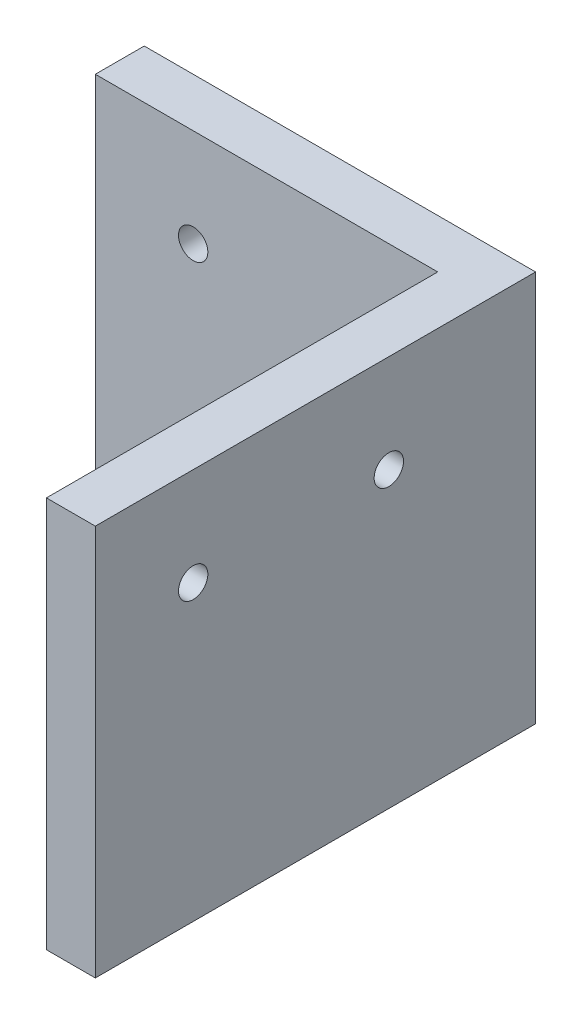
ISO-10303-21;
HEADER;
FILE_DESCRIPTION(('STEP AP214'),'2;1');
FILE_NAME('part.step','',(''),(''),'','','');
FILE_SCHEMA(('AUTOMOTIVE_DESIGN { 1 0 10303 214 1 1 1 1 }'));
ENDSEC;
DATA;
#1=APPLICATION_CONTEXT('core data for automotive mechanical design processes');
#2=APPLICATION_PROTOCOL_DEFINITION('international standard','automotive_design',2000,#1);
#3=PRODUCT_CONTEXT('',#1,'mechanical');
#4=PRODUCT('Part','Part','',(#3));
#5=PRODUCT_RELATED_PRODUCT_CATEGORY('part','',(#4));
#6=PRODUCT_DEFINITION_FORMATION('','',#4);
#7=PRODUCT_DEFINITION_CONTEXT('part definition',#1,'design');
#8=PRODUCT_DEFINITION('design','',#6,#7);
#9=PRODUCT_DEFINITION_SHAPE('','',#8);
#10=(LENGTH_UNIT() NAMED_UNIT(*) SI_UNIT(.MILLI.,.METRE.));
#11=(NAMED_UNIT(*) PLANE_ANGLE_UNIT() SI_UNIT($,.RADIAN.));
#12=(NAMED_UNIT(*) SI_UNIT($,.STERADIAN.) SOLID_ANGLE_UNIT());
#13=UNCERTAINTY_MEASURE_WITH_UNIT(LENGTH_MEASURE(1.E-05),#10,'distance_accuracy_value','');
#14=(GEOMETRIC_REPRESENTATION_CONTEXT(3) GLOBAL_UNCERTAINTY_ASSIGNED_CONTEXT((#13)) GLOBAL_UNIT_ASSIGNED_CONTEXT((#10,
#11,#12)) REPRESENTATION_CONTEXT('',''));
#15=CARTESIAN_POINT('',(0.,0.,0.));
#16=DIRECTION('',(0.,0.,1.));
#17=DIRECTION('',(1.,0.,0.));
#18=AXIS2_PLACEMENT_3D('',#15,#16,#17);
#19=CARTESIAN_POINT('',(0.,85.,18.));
#20=DIRECTION('',(-1.,0.,0.));
#21=DIRECTION('',(0.,0.,1.));
#22=AXIS2_PLACEMENT_3D('',#19,#20,#21);
#23=CYLINDRICAL_SURFACE('',#22,1.5);
#24=CARTESIAN_POINT('',(0.,85.,18.));
#25=DIRECTION('',(-1.,0.,0.));
#26=DIRECTION('',(0.,0.,1.));
#27=AXIS2_PLACEMENT_3D('',#24,#25,#26);
#28=CIRCLE('',#27,1.5);
#29=CARTESIAN_POINT('',(0.,85.,19.5));
#30=VERTEX_POINT('',#29);
#31=EDGE_CURVE('E120',#30,#30,#28,.T.);
#32=ORIENTED_EDGE('',*,*,#31,.F.);
#33=EDGE_LOOP('',(#32));
#34=FACE_BOUND('',#33,.T.);
#35=CARTESIAN_POINT('',(-3.5,85.,18.));
#36=DIRECTION('',(-1.,0.,0.));
#37=DIRECTION('',(0.,0.,1.));
#38=AXIS2_PLACEMENT_3D('',#35,#36,#37);
#39=CIRCLE('',#38,1.5);
#40=CARTESIAN_POINT('',(-3.5,85.,19.5));
#41=VERTEX_POINT('',#40);
#42=EDGE_CURVE('E49',#41,#41,#39,.F.);
#43=ORIENTED_EDGE('',*,*,#42,.F.);
#44=EDGE_LOOP('',(#43));
#45=FACE_BOUND('',#44,.T.);
#46=ADVANCED_FACE('F45',(#34,#45),#23,.F.);
#47=CARTESIAN_POINT('',(0.,85.,38.));
#48=DIRECTION('',(-1.,0.,0.));
#49=DIRECTION('',(0.,0.,1.));
#50=AXIS2_PLACEMENT_3D('',#47,#48,#49);
#51=CYLINDRICAL_SURFACE('',#50,1.5);
#52=CARTESIAN_POINT('',(0.,85.,38.));
#53=DIRECTION('',(-1.,0.,0.));
#54=DIRECTION('',(0.,0.,1.));
#55=AXIS2_PLACEMENT_3D('',#52,#53,#54);
#56=CIRCLE('',#55,1.5);
#57=CARTESIAN_POINT('',(0.,85.,39.5));
#58=VERTEX_POINT('',#57);
#59=EDGE_CURVE('E141',#58,#58,#56,.T.);
#60=ORIENTED_EDGE('',*,*,#59,.F.);
#61=EDGE_LOOP('',(#60));
#62=FACE_BOUND('',#61,.T.);
#63=CARTESIAN_POINT('',(-3.5,85.,38.));
#64=DIRECTION('',(-1.,0.,0.));
#65=DIRECTION('',(0.,0.,1.));
#66=AXIS2_PLACEMENT_3D('',#63,#64,#65);
#67=CIRCLE('',#66,1.5);
#68=CARTESIAN_POINT('',(-3.5,85.,39.5));
#69=VERTEX_POINT('',#68);
#70=EDGE_CURVE('E135',#69,#69,#67,.F.);
#71=ORIENTED_EDGE('',*,*,#70,.F.);
#72=EDGE_LOOP('',(#71));
#73=FACE_BOUND('',#72,.T.);
#74=ADVANCED_FACE('F220',(#62,#73),#51,.F.);
#75=CARTESIAN_POINT('',(-10.,85.,597.1));
#76=DIRECTION('',(0.,0.,-1.));
#77=DIRECTION('',(0.,1.,0.));
#78=AXIS2_PLACEMENT_3D('',#75,#76,#77);
#79=CYLINDRICAL_SURFACE('',#78,1.5);
#80=CARTESIAN_POINT('',(-10.,85.,3.));
#81=DIRECTION('',(0.,0.,-1.));
#82=DIRECTION('',(0.,1.,0.));
#83=AXIS2_PLACEMENT_3D('',#80,#81,#82);
#84=CIRCLE('',#83,1.5);
#85=CARTESIAN_POINT('',(-10.,86.5,3.));
#86=VERTEX_POINT('',#85);
#87=EDGE_CURVE('E174',#86,#86,#84,.T.);
#88=ORIENTED_EDGE('',*,*,#87,.T.);
#89=EDGE_LOOP('',(#88));
#90=FACE_BOUND('',#89,.T.);
#91=CARTESIAN_POINT('',(-10.,85.,8.00000000000001));
#92=DIRECTION('',(0.,0.,-1.));
#93=DIRECTION('',(0.,1.,0.));
#94=AXIS2_PLACEMENT_3D('',#91,#92,#93);
#95=CIRCLE('',#94,1.5);
#96=CARTESIAN_POINT('',(-10.,86.5,8.00000000000001));
#97=VERTEX_POINT('',#96);
#98=EDGE_CURVE('E182',#97,#97,#95,.T.);
#99=ORIENTED_EDGE('',*,*,#98,.F.);
#100=EDGE_LOOP('',(#99));
#101=FACE_BOUND('',#100,.T.);
#102=ADVANCED_FACE('F227',(#90,#101),#79,.F.);
#103=CARTESIAN_POINT('',(-30.,85.,597.1));
#104=DIRECTION('',(0.,0.,-1.));
#105=DIRECTION('',(0.,1.,0.));
#106=AXIS2_PLACEMENT_3D('',#103,#104,#105);
#107=CYLINDRICAL_SURFACE('',#106,1.5);
#108=CARTESIAN_POINT('',(-30.,85.,3.));
#109=DIRECTION('',(0.,0.,-1.));
#110=DIRECTION('',(0.,1.,0.));
#111=AXIS2_PLACEMENT_3D('',#108,#109,#110);
#112=CIRCLE('',#111,1.5);
#113=CARTESIAN_POINT('',(-30.,86.5,3.));
#114=VERTEX_POINT('',#113);
#115=EDGE_CURVE('E171',#114,#114,#112,.T.);
#116=ORIENTED_EDGE('',*,*,#115,.T.);
#117=EDGE_LOOP('',(#116));
#118=FACE_BOUND('',#117,.T.);
#119=CARTESIAN_POINT('',(-30.,85.,8.00000000000001));
#120=DIRECTION('',(0.,0.,-1.));
#121=DIRECTION('',(0.,1.,0.));
#122=AXIS2_PLACEMENT_3D('',#119,#120,#121);
#123=CIRCLE('',#122,1.5);
#124=CARTESIAN_POINT('',(-30.,86.5,8.00000000000001));
#125=VERTEX_POINT('',#124);
#126=EDGE_CURVE('E185',#125,#125,#123,.T.);
#127=ORIENTED_EDGE('',*,*,#126,.F.);
#128=EDGE_LOOP('',(#127));
#129=FACE_BOUND('',#128,.T.);
#130=ADVANCED_FACE('F240',(#118,#129),#107,.F.);
#131=CARTESIAN_POINT('',(-30.,65.,597.1));
#132=DIRECTION('',(0.,0.,-1.));
#133=DIRECTION('',(0.,1.,0.));
#134=AXIS2_PLACEMENT_3D('',#131,#132,#133);
#135=CYLINDRICAL_SURFACE('',#134,1.50000000000001);
#136=CARTESIAN_POINT('',(-30.,65.,3.));
#137=DIRECTION('',(0.,0.,-1.));
#138=DIRECTION('',(0.,1.,0.));
#139=AXIS2_PLACEMENT_3D('',#136,#137,#138);
#140=CIRCLE('',#139,1.50000000000001);
#141=CARTESIAN_POINT('',(-30.,66.5,3.));
#142=VERTEX_POINT('',#141);
#143=EDGE_CURVE('E175',#142,#142,#140,.T.);
#144=ORIENTED_EDGE('',*,*,#143,.T.);
#145=EDGE_LOOP('',(#144));
#146=FACE_BOUND('',#145,.T.);
#147=CARTESIAN_POINT('',(-30.,65.,8.00000000000001));
#148=DIRECTION('',(0.,0.,-1.));
#149=DIRECTION('',(0.,1.,0.));
#150=AXIS2_PLACEMENT_3D('',#147,#148,#149);
#151=CIRCLE('',#150,1.50000000000001);
#152=CARTESIAN_POINT('',(-30.,66.5,8.00000000000001));
#153=VERTEX_POINT('',#152);
#154=EDGE_CURVE('E188',#153,#153,#151,.T.);
#155=ORIENTED_EDGE('',*,*,#154,.F.);
#156=EDGE_LOOP('',(#155));
#157=FACE_BOUND('',#156,.T.);
#158=ADVANCED_FACE('F243',(#146,#157),#135,.F.);
#159=CARTESIAN_POINT('',(-10.,65.,597.1));
#160=DIRECTION('',(0.,0.,-1.));
#161=DIRECTION('',(0.,1.,0.));
#162=AXIS2_PLACEMENT_3D('',#159,#160,#161);
#163=CYLINDRICAL_SURFACE('',#162,1.5);
#164=CARTESIAN_POINT('',(-10.,65.,3.));
#165=DIRECTION('',(0.,0.,-1.));
#166=DIRECTION('',(0.,1.,0.));
#167=AXIS2_PLACEMENT_3D('',#164,#165,#166);
#168=CIRCLE('',#167,1.5);
#169=CARTESIAN_POINT('',(-10.,66.5,3.));
#170=VERTEX_POINT('',#169);
#171=EDGE_CURVE('E170',#170,#170,#168,.T.);
#172=ORIENTED_EDGE('',*,*,#171,.T.);
#173=EDGE_LOOP('',(#172));
#174=FACE_BOUND('',#173,.T.);
#175=CARTESIAN_POINT('',(-10.,65.,8.00000000000001));
#176=DIRECTION('',(0.,0.,-1.));
#177=DIRECTION('',(0.,1.,0.));
#178=AXIS2_PLACEMENT_3D('',#175,#176,#177);
#179=CIRCLE('',#178,1.5);
#180=CARTESIAN_POINT('',(-10.,66.5,8.00000000000001));
#181=VERTEX_POINT('',#180);
#182=EDGE_CURVE('E111',#181,#181,#179,.T.);
#183=ORIENTED_EDGE('',*,*,#182,.F.);
#184=EDGE_LOOP('',(#183));
#185=FACE_BOUND('',#184,.T.);
#186=ADVANCED_FACE('F247',(#174,#185),#163,.F.);
#187=CARTESIAN_POINT('',(-40.,0.,0.));
#188=DIRECTION('',(-1.,0.,0.));
#189=DIRECTION('',(0.,0.,1.));
#190=AXIS2_PLACEMENT_3D('',#187,#188,#189);
#191=PLANE('',#190);
#192=DIRECTION('',(0.,-1.,0.));
#193=VECTOR('',#192,1.);
#194=CARTESIAN_POINT('',(-40.,95.,3.));
#195=LINE('',#194,#193);
#196=CARTESIAN_POINT('',(-40.,95.,3.));
#197=VERTEX_POINT('',#196);
#198=CARTESIAN_POINT('',(-40.,55.,3.));
#199=VERTEX_POINT('',#198);
#200=EDGE_CURVE('E123',#197,#199,#195,.T.);
#201=ORIENTED_EDGE('',*,*,#200,.T.);
#202=DIRECTION('',(0.,0.,1.));
#203=VECTOR('',#202,1.);
#204=CARTESIAN_POINT('',(-40.,55.,3.));
#205=LINE('',#204,#203);
#206=CARTESIAN_POINT('',(-40.,55.,8.00000000000001));
#207=VERTEX_POINT('',#206);
#208=EDGE_CURVE('E194',#199,#207,#205,.T.);
#209=ORIENTED_EDGE('',*,*,#208,.T.);
#210=DIRECTION('',(0.,1.,0.));
#211=VECTOR('',#210,1.);
#212=CARTESIAN_POINT('',(-40.,95.,8.));
#213=LINE('',#212,#211);
#214=CARTESIAN_POINT('',(-40.,95.,8.));
#215=VERTEX_POINT('',#214);
#216=EDGE_CURVE('E129',#207,#215,#213,.T.);
#217=ORIENTED_EDGE('',*,*,#216,.T.);
#218=DIRECTION('',(0.,0.,-1.));
#219=VECTOR('',#218,1.);
#220=CARTESIAN_POINT('',(-40.,95.,3.));
#221=LINE('',#220,#219);
#222=EDGE_CURVE('E69',#215,#197,#221,.T.);
#223=ORIENTED_EDGE('',*,*,#222,.T.);
#224=EDGE_LOOP('',(#201,#209,#217,#223));
#225=FACE_BOUND('',#224,.T.);
#226=ADVANCED_FACE('F198',(#225),#191,.T.);
#227=CARTESIAN_POINT('',(-40.,95.,8.));
#228=DIRECTION('',(0.,0.,-1.));
#229=DIRECTION('',(0.,1.,0.));
#230=AXIS2_PLACEMENT_3D('',#227,#228,#229);
#231=PLANE('',#230);
#232=ORIENTED_EDGE('',*,*,#182,.T.);
#233=EDGE_LOOP('',(#232));
#234=FACE_BOUND('',#233,.T.);
#235=ORIENTED_EDGE('',*,*,#154,.T.);
#236=EDGE_LOOP('',(#235));
#237=FACE_BOUND('',#236,.T.);
#238=ORIENTED_EDGE('',*,*,#126,.T.);
#239=EDGE_LOOP('',(#238));
#240=FACE_BOUND('',#239,.T.);
#241=ORIENTED_EDGE('',*,*,#98,.T.);
#242=EDGE_LOOP('',(#241));
#243=FACE_BOUND('',#242,.T.);
#244=DIRECTION('',(1.,0.,0.));
#245=VECTOR('',#244,1.);
#246=CARTESIAN_POINT('',(-40.,55.,8.00000000000001));
#247=LINE('',#246,#245);
#248=CARTESIAN_POINT('',(-5.,55.,8.00000000000001));
#249=VERTEX_POINT('',#248);
#250=EDGE_CURVE('E127',#207,#249,#247,.T.);
#251=ORIENTED_EDGE('',*,*,#250,.T.);
#252=DIRECTION('',(0.,1.,0.));
#253=VECTOR('',#252,1.);
#254=CARTESIAN_POINT('',(-5.,95.,8.));
#255=LINE('',#254,#253);
#256=CARTESIAN_POINT('',(-5.,95.,8.));
#257=VERTEX_POINT('',#256);
#258=EDGE_CURVE('E11',#249,#257,#255,.T.);
#259=ORIENTED_EDGE('',*,*,#258,.T.);
#260=DIRECTION('',(1.,0.,0.));
#261=VECTOR('',#260,1.);
#262=CARTESIAN_POINT('',(-40.,95.,8.));
#263=LINE('',#262,#261);
#264=EDGE_CURVE('E124',#215,#257,#263,.T.);
#265=ORIENTED_EDGE('',*,*,#264,.F.);
#266=ORIENTED_EDGE('',*,*,#216,.F.);
#267=EDGE_LOOP('',(#251,#259,#265,#266));
#268=FACE_BOUND('',#267,.T.);
#269=ADVANCED_FACE('F201',(#234,#237,#240,#243,#268),#231,.F.);
#270=CARTESIAN_POINT('',(-5.,95.,48.));
#271=DIRECTION('',(0.,0.,-1.));
#272=DIRECTION('',(0.,1.,0.));
#273=AXIS2_PLACEMENT_3D('',#270,#271,#272);
#274=PLANE('',#273);
#275=DIRECTION('',(0.,1.,0.));
#276=VECTOR('',#275,1.);
#277=CARTESIAN_POINT('',(0.,95.,48.));
#278=LINE('',#277,#276);
#279=CARTESIAN_POINT('',(0.,55.,48.));
#280=VERTEX_POINT('',#279);
#281=CARTESIAN_POINT('',(0.,95.,48.));
#282=VERTEX_POINT('',#281);
#283=EDGE_CURVE('E119',#280,#282,#278,.T.);
#284=ORIENTED_EDGE('',*,*,#283,.T.);
#285=DIRECTION('',(1.,0.,0.));
#286=VECTOR('',#285,1.);
#287=CARTESIAN_POINT('',(-5.,95.,48.));
#288=LINE('',#287,#286);
#289=CARTESIAN_POINT('',(-5.,95.,48.));
#290=VERTEX_POINT('',#289);
#291=EDGE_CURVE('E117',#290,#282,#288,.T.);
#292=ORIENTED_EDGE('',*,*,#291,.F.);
#293=DIRECTION('',(0.,1.,0.));
#294=VECTOR('',#293,1.);
#295=CARTESIAN_POINT('',(-5.,95.,48.));
#296=LINE('',#295,#294);
#297=CARTESIAN_POINT('',(-5.,55.,48.));
#298=VERTEX_POINT('',#297);
#299=EDGE_CURVE('E160',#298,#290,#296,.T.);
#300=ORIENTED_EDGE('',*,*,#299,.F.);
#301=DIRECTION('',(1.,0.,0.));
#302=VECTOR('',#301,1.);
#303=CARTESIAN_POINT('',(-5.,55.,48.));
#304=LINE('',#303,#302);
#305=EDGE_CURVE('E165',#298,#280,#304,.T.);
#306=ORIENTED_EDGE('',*,*,#305,.T.);
#307=EDGE_LOOP('',(#284,#292,#300,#306));
#308=FACE_BOUND('',#307,.T.);
#309=ADVANCED_FACE('F207',(#308),#274,.F.);
#310=CARTESIAN_POINT('',(-40.,55.,3.));
#311=DIRECTION('',(0.,1.,0.));
#312=DIRECTION('',(0.,0.,1.));
#313=AXIS2_PLACEMENT_3D('',#310,#311,#312);
#314=PLANE('',#313);
#315=DIRECTION('',(0.,0.,1.));
#316=VECTOR('',#315,1.);
#317=CARTESIAN_POINT('',(0.,55.,3.));
#318=LINE('',#317,#316);
#319=CARTESIAN_POINT('',(0.,55.,3.));
#320=VERTEX_POINT('',#319);
#321=EDGE_CURVE('E106',#320,#280,#318,.T.);
#322=ORIENTED_EDGE('',*,*,#321,.T.);
#323=ORIENTED_EDGE('',*,*,#305,.F.);
#324=DIRECTION('',(0.,0.,1.));
#325=VECTOR('',#324,1.);
#326=CARTESIAN_POINT('',(-5.,55.,48.));
#327=LINE('',#326,#325);
#328=EDGE_CURVE('E163',#249,#298,#327,.T.);
#329=ORIENTED_EDGE('',*,*,#328,.F.);
#330=ORIENTED_EDGE('',*,*,#250,.F.);
#331=ORIENTED_EDGE('',*,*,#208,.F.);
#332=DIRECTION('',(1.,0.,0.));
#333=VECTOR('',#332,1.);
#334=CARTESIAN_POINT('',(-40.,55.,3.));
#335=LINE('',#334,#333);
#336=EDGE_CURVE('E54',#199,#320,#335,.T.);
#337=ORIENTED_EDGE('',*,*,#336,.T.);
#338=EDGE_LOOP('',(#322,#323,#329,#330,#331,#337));
#339=FACE_BOUND('',#338,.T.);
#340=ADVANCED_FACE('F209',(#339),#314,.F.);
#341=CARTESIAN_POINT('',(-40.,95.,3.));
#342=DIRECTION('',(0.,0.,1.));
#343=DIRECTION('',(0.,-1.,0.));
#344=AXIS2_PLACEMENT_3D('',#341,#342,#343);
#345=PLANE('',#344);
#346=ORIENTED_EDGE('',*,*,#171,.F.);
#347=EDGE_LOOP('',(#346));
#348=FACE_BOUND('',#347,.T.);
#349=ORIENTED_EDGE('',*,*,#143,.F.);
#350=EDGE_LOOP('',(#349));
#351=FACE_BOUND('',#350,.T.);
#352=ORIENTED_EDGE('',*,*,#115,.F.);
#353=EDGE_LOOP('',(#352));
#354=FACE_BOUND('',#353,.T.);
#355=ORIENTED_EDGE('',*,*,#87,.F.);
#356=EDGE_LOOP('',(#355));
#357=FACE_BOUND('',#356,.T.);
#358=DIRECTION('',(0.,-1.,0.));
#359=VECTOR('',#358,1.);
#360=CARTESIAN_POINT('',(0.,95.,3.));
#361=LINE('',#360,#359);
#362=CARTESIAN_POINT('',(0.,95.,3.));
#363=VERTEX_POINT('',#362);
#364=EDGE_CURVE('E99',#363,#320,#361,.T.);
#365=ORIENTED_EDGE('',*,*,#364,.T.);
#366=ORIENTED_EDGE('',*,*,#336,.F.);
#367=ORIENTED_EDGE('',*,*,#200,.F.);
#368=DIRECTION('',(1.,0.,0.));
#369=VECTOR('',#368,1.);
#370=CARTESIAN_POINT('',(-40.,95.,3.));
#371=LINE('',#370,#369);
#372=EDGE_CURVE('E114',#197,#363,#371,.T.);
#373=ORIENTED_EDGE('',*,*,#372,.T.);
#374=EDGE_LOOP('',(#365,#366,#367,#373));
#375=FACE_BOUND('',#374,.T.);
#376=ADVANCED_FACE('F122',(#348,#351,#354,#357,#375),#345,.F.);
#377=CARTESIAN_POINT('',(0.,95.,597.1));
#378=DIRECTION('',(0.,1.,0.));
#379=DIRECTION('',(0.,0.,1.));
#380=AXIS2_PLACEMENT_3D('',#377,#378,#379);
#381=PLANE('',#380);
#382=DIRECTION('',(0.,0.,-1.));
#383=VECTOR('',#382,1.);
#384=CARTESIAN_POINT('',(0.,95.,597.1));
#385=LINE('',#384,#383);
#386=EDGE_CURVE('E103',#282,#363,#385,.T.);
#387=ORIENTED_EDGE('',*,*,#386,.T.);
#388=ORIENTED_EDGE('',*,*,#372,.F.);
#389=ORIENTED_EDGE('',*,*,#222,.F.);
#390=ORIENTED_EDGE('',*,*,#264,.T.);
#391=DIRECTION('',(0.,0.,-1.));
#392=VECTOR('',#391,1.);
#393=CARTESIAN_POINT('',(-5.,95.,48.));
#394=LINE('',#393,#392);
#395=EDGE_CURVE('E62',#290,#257,#394,.T.);
#396=ORIENTED_EDGE('',*,*,#395,.F.);
#397=ORIENTED_EDGE('',*,*,#291,.T.);
#398=EDGE_LOOP('',(#387,#388,#389,#390,#396,#397));
#399=FACE_BOUND('',#398,.T.);
#400=ADVANCED_FACE('F47',(#399),#381,.T.);
#401=CARTESIAN_POINT('',(-5.,0.,0.));
#402=DIRECTION('',(1.,0.,0.));
#403=DIRECTION('',(0.,0.,-1.));
#404=AXIS2_PLACEMENT_3D('',#401,#402,#403);
#405=PLANE('',#404);
#406=CARTESIAN_POINT('',(-5.,85.,18.));
#407=DIRECTION('',(-1.,0.,0.));
#408=DIRECTION('',(0.,0.,1.));
#409=AXIS2_PLACEMENT_3D('',#406,#407,#408);
#410=CIRCLE('',#409,3.5);
#411=CARTESIAN_POINT('',(-5.,85.,21.5));
#412=VERTEX_POINT('',#411);
#413=EDGE_CURVE('E143',#412,#412,#410,.T.);
#414=ORIENTED_EDGE('',*,*,#413,.F.);
#415=EDGE_LOOP('',(#414));
#416=FACE_BOUND('',#415,.T.);
#417=CARTESIAN_POINT('',(-5.,85.,38.));
#418=DIRECTION('',(-1.,0.,0.));
#419=DIRECTION('',(0.,0.,1.));
#420=AXIS2_PLACEMENT_3D('',#417,#418,#419);
#421=CIRCLE('',#420,3.5);
#422=CARTESIAN_POINT('',(-5.,85.,41.5));
#423=VERTEX_POINT('',#422);
#424=EDGE_CURVE('E148',#423,#423,#421,.T.);
#425=ORIENTED_EDGE('',*,*,#424,.F.);
#426=EDGE_LOOP('',(#425));
#427=FACE_BOUND('',#426,.T.);
#428=ORIENTED_EDGE('',*,*,#299,.T.);
#429=ORIENTED_EDGE('',*,*,#395,.T.);
#430=ORIENTED_EDGE('',*,*,#258,.F.);
#431=ORIENTED_EDGE('',*,*,#328,.T.);
#432=EDGE_LOOP('',(#428,#429,#430,#431));
#433=FACE_BOUND('',#432,.T.);
#434=ADVANCED_FACE('F203',(#416,#427,#433),#405,.F.);
#435=CARTESIAN_POINT('',(0.,95.,597.1));
#436=DIRECTION('',(-1.,0.,0.));
#437=DIRECTION('',(0.,0.,1.));
#438=AXIS2_PLACEMENT_3D('',#435,#436,#437);
#439=PLANE('',#438);
#440=ORIENTED_EDGE('',*,*,#386,.F.);
#441=ORIENTED_EDGE('',*,*,#283,.F.);
#442=ORIENTED_EDGE('',*,*,#321,.F.);
#443=ORIENTED_EDGE('',*,*,#364,.F.);
#444=EDGE_LOOP('',(#440,#441,#442,#443));
#445=FACE_BOUND('',#444,.T.);
#446=ORIENTED_EDGE('',*,*,#31,.T.);
#447=EDGE_LOOP('',(#446));
#448=FACE_BOUND('',#447,.T.);
#449=ORIENTED_EDGE('',*,*,#59,.T.);
#450=EDGE_LOOP('',(#449));
#451=FACE_BOUND('',#450,.T.);
#452=ADVANCED_FACE('F101',(#445,#448,#451),#439,.F.);
#453=CARTESIAN_POINT('',(-3.5,85.,38.));
#454=DIRECTION('',(-1.,0.,0.));
#455=DIRECTION('',(0.,0.,1.));
#456=AXIS2_PLACEMENT_3D('',#453,#454,#455);
#457=PLANE('',#456);
#458=CARTESIAN_POINT('',(-3.5,85.,38.));
#459=DIRECTION('',(-1.,0.,0.));
#460=DIRECTION('',(0.,0.,1.));
#461=AXIS2_PLACEMENT_3D('',#458,#459,#460);
#462=CIRCLE('',#461,3.5);
#463=CARTESIAN_POINT('',(-3.5,85.,41.5));
#464=VERTEX_POINT('',#463);
#465=EDGE_CURVE('E153',#464,#464,#462,.T.);
#466=ORIENTED_EDGE('',*,*,#465,.T.);
#467=EDGE_LOOP('',(#466));
#468=FACE_BOUND('',#467,.T.);
#469=ORIENTED_EDGE('',*,*,#70,.T.);
#470=EDGE_LOOP('',(#469));
#471=FACE_BOUND('',#470,.T.);
#472=ADVANCED_FACE('F236',(#468,#471),#457,.T.);
#473=CARTESIAN_POINT('',(-3.5,85.,38.));
#474=DIRECTION('',(-1.,0.,0.));
#475=DIRECTION('',(0.,0.,1.));
#476=AXIS2_PLACEMENT_3D('',#473,#474,#475);
#477=CYLINDRICAL_SURFACE('',#476,3.5);
#478=ORIENTED_EDGE('',*,*,#465,.F.);
#479=EDGE_LOOP('',(#478));
#480=FACE_BOUND('',#479,.T.);
#481=ORIENTED_EDGE('',*,*,#424,.T.);
#482=EDGE_LOOP('',(#481));
#483=FACE_BOUND('',#482,.T.);
#484=ADVANCED_FACE('F333',(#480,#483),#477,.F.);
#485=CARTESIAN_POINT('',(-3.5,85.,18.));
#486=DIRECTION('',(-1.,0.,0.));
#487=DIRECTION('',(0.,0.,1.));
#488=AXIS2_PLACEMENT_3D('',#485,#486,#487);
#489=PLANE('',#488);
#490=CARTESIAN_POINT('',(-3.5,85.,18.));
#491=DIRECTION('',(-1.,0.,0.));
#492=DIRECTION('',(0.,0.,1.));
#493=AXIS2_PLACEMENT_3D('',#490,#491,#492);
#494=CIRCLE('',#493,3.5);
#495=CARTESIAN_POINT('',(-3.5,85.,21.5));
#496=VERTEX_POINT('',#495);
#497=EDGE_CURVE('E137',#496,#496,#494,.T.);
#498=ORIENTED_EDGE('',*,*,#497,.T.);
#499=EDGE_LOOP('',(#498));
#500=FACE_BOUND('',#499,.T.);
#501=ORIENTED_EDGE('',*,*,#42,.T.);
#502=EDGE_LOOP('',(#501));
#503=FACE_BOUND('',#502,.T.);
#504=ADVANCED_FACE('F341',(#500,#503),#489,.T.);
#505=CARTESIAN_POINT('',(-3.5,85.,18.));
#506=DIRECTION('',(-1.,0.,0.));
#507=DIRECTION('',(0.,0.,1.));
#508=AXIS2_PLACEMENT_3D('',#505,#506,#507);
#509=CYLINDRICAL_SURFACE('',#508,3.5);
#510=ORIENTED_EDGE('',*,*,#497,.F.);
#511=EDGE_LOOP('',(#510));
#512=FACE_BOUND('',#511,.T.);
#513=ORIENTED_EDGE('',*,*,#413,.T.);
#514=EDGE_LOOP('',(#513));
#515=FACE_BOUND('',#514,.T.);
#516=ADVANCED_FACE('F351',(#512,#515),#509,.F.);
#517=CLOSED_SHELL('',(#46,#74,#102,#130,#158,#186,#226,#269,#309,#340,#376,#400,#434,#452,#472,
#484,#504,#516));
#518=MANIFOLD_SOLID_BREP('B2',#517);
#519=ADVANCED_BREP_SHAPE_REPRESENTATION('',(#18,#518),#14);
#520=SHAPE_DEFINITION_REPRESENTATION(#9,#519);
ENDSEC;
END-ISO-10303-21;
